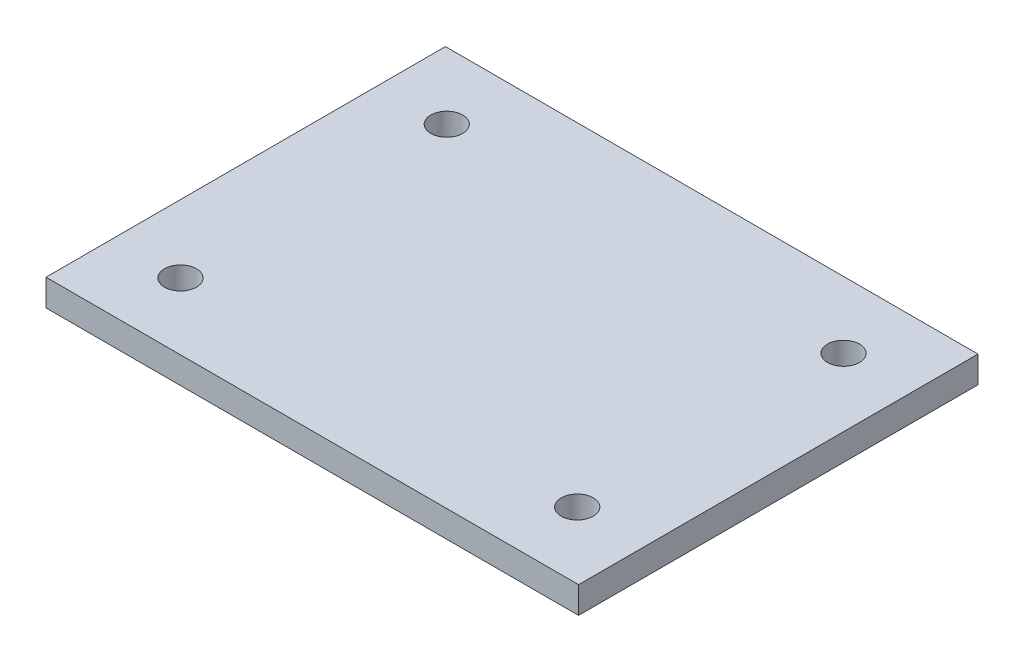
ISO-10303-21;
HEADER;
FILE_DESCRIPTION(('STEP AP214'),'2;1');
FILE_NAME('part.step','',(''),(''),'','','');
FILE_SCHEMA(('AUTOMOTIVE_DESIGN { 1 0 10303 214 1 1 1 1 }'));
ENDSEC;
DATA;
#1=APPLICATION_CONTEXT('core data for automotive mechanical design processes');
#2=APPLICATION_PROTOCOL_DEFINITION('international standard','automotive_design',2000,#1);
#3=PRODUCT_CONTEXT('',#1,'mechanical');
#4=PRODUCT('Part','Part','',(#3));
#5=PRODUCT_RELATED_PRODUCT_CATEGORY('part','',(#4));
#6=PRODUCT_DEFINITION_FORMATION('','',#4);
#7=PRODUCT_DEFINITION_CONTEXT('part definition',#1,'design');
#8=PRODUCT_DEFINITION('design','',#6,#7);
#9=PRODUCT_DEFINITION_SHAPE('','',#8);
#10=(LENGTH_UNIT() NAMED_UNIT(*) SI_UNIT(.MILLI.,.METRE.));
#11=(NAMED_UNIT(*) PLANE_ANGLE_UNIT() SI_UNIT($,.RADIAN.));
#12=(NAMED_UNIT(*) SI_UNIT($,.STERADIAN.) SOLID_ANGLE_UNIT());
#13=UNCERTAINTY_MEASURE_WITH_UNIT(LENGTH_MEASURE(1.E-05),#10,'distance_accuracy_value','');
#14=(GEOMETRIC_REPRESENTATION_CONTEXT(3) GLOBAL_UNCERTAINTY_ASSIGNED_CONTEXT((#13)) GLOBAL_UNIT_ASSIGNED_CONTEXT((#10,
#11,#12)) REPRESENTATION_CONTEXT('',''));
#15=CARTESIAN_POINT('',(0.,0.,0.));
#16=DIRECTION('',(0.,0.,1.));
#17=DIRECTION('',(1.,0.,0.));
#18=AXIS2_PLACEMENT_3D('',#15,#16,#17);
#19=CARTESIAN_POINT('',(100.,10.,75.));
#20=DIRECTION('',(-1.,0.,0.));
#21=DIRECTION('',(0.,0.,1.));
#22=AXIS2_PLACEMENT_3D('',#19,#20,#21);
#23=PLANE('',#22);
#24=DIRECTION('',(0.,0.,-1.));
#25=VECTOR('',#24,1.);
#26=CARTESIAN_POINT('',(100.,0.,75.));
#27=LINE('',#26,#25);
#28=CARTESIAN_POINT('',(100.,0.,75.));
#29=VERTEX_POINT('',#28);
#30=CARTESIAN_POINT('',(100.,0.,-75.));
#31=VERTEX_POINT('',#30);
#32=EDGE_CURVE('E98',#29,#31,#27,.T.);
#33=ORIENTED_EDGE('',*,*,#32,.T.);
#34=DIRECTION('',(0.,-1.,0.));
#35=VECTOR('',#34,1.);
#36=CARTESIAN_POINT('',(100.,10.,-75.));
#37=LINE('',#36,#35);
#38=CARTESIAN_POINT('',(100.,10.,-75.));
#39=VERTEX_POINT('',#38);
#40=EDGE_CURVE('E11',#39,#31,#37,.T.);
#41=ORIENTED_EDGE('',*,*,#40,.F.);
#42=DIRECTION('',(0.,0.,-1.));
#43=VECTOR('',#42,1.);
#44=CARTESIAN_POINT('',(100.,10.,75.));
#45=LINE('',#44,#43);
#46=CARTESIAN_POINT('',(100.,10.,75.));
#47=VERTEX_POINT('',#46);
#48=EDGE_CURVE('E86',#47,#39,#45,.T.);
#49=ORIENTED_EDGE('',*,*,#48,.F.);
#50=DIRECTION('',(0.,-1.,0.));
#51=VECTOR('',#50,1.);
#52=CARTESIAN_POINT('',(100.,10.,75.));
#53=LINE('',#52,#51);
#54=EDGE_CURVE('E94',#47,#29,#53,.T.);
#55=ORIENTED_EDGE('',*,*,#54,.T.);
#56=EDGE_LOOP('',(#33,#41,#49,#55));
#57=FACE_BOUND('',#56,.T.);
#58=ADVANCED_FACE('F35',(#57),#23,.F.);
#59=CARTESIAN_POINT('',(-100.,10.,-75.));
#60=DIRECTION('',(0.,0.,1.));
#61=DIRECTION('',(1.,0.,0.));
#62=AXIS2_PLACEMENT_3D('',#59,#60,#61);
#63=PLANE('',#62);
#64=DIRECTION('',(-1.,0.,0.));
#65=VECTOR('',#64,1.);
#66=CARTESIAN_POINT('',(-100.,0.,-75.));
#67=LINE('',#66,#65);
#68=CARTESIAN_POINT('',(-100.,0.,-75.));
#69=VERTEX_POINT('',#68);
#70=EDGE_CURVE('E90',#31,#69,#67,.T.);
#71=ORIENTED_EDGE('',*,*,#70,.T.);
#72=DIRECTION('',(0.,-1.,0.));
#73=VECTOR('',#72,1.);
#74=CARTESIAN_POINT('',(-100.,10.,-75.));
#75=LINE('',#74,#73);
#76=CARTESIAN_POINT('',(-100.,10.,-75.));
#77=VERTEX_POINT('',#76);
#78=EDGE_CURVE('E43',#77,#69,#75,.T.);
#79=ORIENTED_EDGE('',*,*,#78,.F.);
#80=DIRECTION('',(-1.,0.,0.));
#81=VECTOR('',#80,1.);
#82=CARTESIAN_POINT('',(-100.,10.,-75.));
#83=LINE('',#82,#81);
#84=EDGE_CURVE('E81',#39,#77,#83,.T.);
#85=ORIENTED_EDGE('',*,*,#84,.F.);
#86=ORIENTED_EDGE('',*,*,#40,.T.);
#87=EDGE_LOOP('',(#71,#79,#85,#86));
#88=FACE_BOUND('',#87,.T.);
#89=ADVANCED_FACE('F89',(#88),#63,.F.);
#90=CARTESIAN_POINT('',(-100.,10.,75.));
#91=DIRECTION('',(1.,0.,0.));
#92=DIRECTION('',(0.,0.,-1.));
#93=AXIS2_PLACEMENT_3D('',#90,#91,#92);
#94=PLANE('',#93);
#95=DIRECTION('',(0.,0.,1.));
#96=VECTOR('',#95,1.);
#97=CARTESIAN_POINT('',(-100.,0.,75.));
#98=LINE('',#97,#96);
#99=CARTESIAN_POINT('',(-100.,0.,75.));
#100=VERTEX_POINT('',#99);
#101=EDGE_CURVE('E68',#69,#100,#98,.T.);
#102=ORIENTED_EDGE('',*,*,#101,.T.);
#103=DIRECTION('',(0.,-1.,0.));
#104=VECTOR('',#103,1.);
#105=CARTESIAN_POINT('',(-100.,10.,75.));
#106=LINE('',#105,#104);
#107=CARTESIAN_POINT('',(-100.,10.,75.));
#108=VERTEX_POINT('',#107);
#109=EDGE_CURVE('E91',#108,#100,#106,.T.);
#110=ORIENTED_EDGE('',*,*,#109,.F.);
#111=DIRECTION('',(0.,0.,1.));
#112=VECTOR('',#111,1.);
#113=CARTESIAN_POINT('',(-100.,10.,75.));
#114=LINE('',#113,#112);
#115=EDGE_CURVE('E84',#77,#108,#114,.T.);
#116=ORIENTED_EDGE('',*,*,#115,.F.);
#117=ORIENTED_EDGE('',*,*,#78,.T.);
#118=EDGE_LOOP('',(#102,#110,#116,#117));
#119=FACE_BOUND('',#118,.T.);
#120=ADVANCED_FACE('F92',(#119),#94,.F.);
#121=CARTESIAN_POINT('',(-100.,10.,75.));
#122=DIRECTION('',(0.,0.,-1.));
#123=DIRECTION('',(-1.,0.,0.));
#124=AXIS2_PLACEMENT_3D('',#121,#122,#123);
#125=PLANE('',#124);
#126=DIRECTION('',(1.,0.,0.));
#127=VECTOR('',#126,1.);
#128=CARTESIAN_POINT('',(-100.,0.,75.));
#129=LINE('',#128,#127);
#130=EDGE_CURVE('E74',#100,#29,#129,.T.);
#131=ORIENTED_EDGE('',*,*,#130,.T.);
#132=ORIENTED_EDGE('',*,*,#54,.F.);
#133=DIRECTION('',(1.,0.,0.));
#134=VECTOR('',#133,1.);
#135=CARTESIAN_POINT('',(-100.,10.,75.));
#136=LINE('',#135,#134);
#137=EDGE_CURVE('E51',#108,#47,#136,.T.);
#138=ORIENTED_EDGE('',*,*,#137,.F.);
#139=ORIENTED_EDGE('',*,*,#109,.T.);
#140=EDGE_LOOP('',(#131,#132,#138,#139));
#141=FACE_BOUND('',#140,.T.);
#142=ADVANCED_FACE('F106',(#141),#125,.F.);
#143=CARTESIAN_POINT('',(0.,10.,0.));
#144=DIRECTION('',(0.,-1.,0.));
#145=DIRECTION('',(0.,0.,-1.));
#146=AXIS2_PLACEMENT_3D('',#143,#144,#145);
#147=PLANE('',#146);
#148=CARTESIAN_POINT('',(-74.5,10.,-50.));
#149=DIRECTION('',(0.,1.,0.));
#150=DIRECTION('',(0.,0.,1.));
#151=AXIS2_PLACEMENT_3D('',#148,#149,#150);
#152=CIRCLE('',#151,6.);
#153=CARTESIAN_POINT('',(-74.5,10.,-44.));
#154=VERTEX_POINT('',#153);
#155=EDGE_CURVE('E127',#154,#154,#152,.T.);
#156=ORIENTED_EDGE('',*,*,#155,.F.);
#157=EDGE_LOOP('',(#156));
#158=FACE_BOUND('',#157,.T.);
#159=CARTESIAN_POINT('',(-74.5,10.,50.));
#160=DIRECTION('',(0.,1.,0.));
#161=DIRECTION('',(0.,0.,1.));
#162=AXIS2_PLACEMENT_3D('',#159,#160,#161);
#163=CIRCLE('',#162,6.);
#164=CARTESIAN_POINT('',(-74.5,10.,56.));
#165=VERTEX_POINT('',#164);
#166=EDGE_CURVE('E121',#165,#165,#163,.T.);
#167=ORIENTED_EDGE('',*,*,#166,.F.);
#168=EDGE_LOOP('',(#167));
#169=FACE_BOUND('',#168,.T.);
#170=CARTESIAN_POINT('',(74.5,10.,50.));
#171=DIRECTION('',(0.,1.,0.));
#172=DIRECTION('',(0.,0.,1.));
#173=AXIS2_PLACEMENT_3D('',#170,#171,#172);
#174=CIRCLE('',#173,6.);
#175=CARTESIAN_POINT('',(74.5,10.,56.));
#176=VERTEX_POINT('',#175);
#177=EDGE_CURVE('E115',#176,#176,#174,.T.);
#178=ORIENTED_EDGE('',*,*,#177,.F.);
#179=EDGE_LOOP('',(#178));
#180=FACE_BOUND('',#179,.T.);
#181=CARTESIAN_POINT('',(74.5,10.,-50.));
#182=DIRECTION('',(0.,1.,0.));
#183=DIRECTION('',(0.,0.,1.));
#184=AXIS2_PLACEMENT_3D('',#181,#182,#183);
#185=CIRCLE('',#184,6.);
#186=CARTESIAN_POINT('',(74.5,10.,-44.));
#187=VERTEX_POINT('',#186);
#188=EDGE_CURVE('E101',#187,#187,#185,.T.);
#189=ORIENTED_EDGE('',*,*,#188,.F.);
#190=EDGE_LOOP('',(#189));
#191=FACE_BOUND('',#190,.T.);
#192=ORIENTED_EDGE('',*,*,#48,.T.);
#193=ORIENTED_EDGE('',*,*,#84,.T.);
#194=ORIENTED_EDGE('',*,*,#115,.T.);
#195=ORIENTED_EDGE('',*,*,#137,.T.);
#196=EDGE_LOOP('',(#192,#193,#194,#195));
#197=FACE_BOUND('',#196,.T.);
#198=ADVANCED_FACE('F82',(#158,#169,#180,#191,#197),#147,.F.);
#199=CARTESIAN_POINT('',(0.,0.,0.));
#200=DIRECTION('',(0.,-1.,0.));
#201=DIRECTION('',(0.,0.,-1.));
#202=AXIS2_PLACEMENT_3D('',#199,#200,#201);
#203=PLANE('',#202);
#204=CARTESIAN_POINT('',(-74.5,0.,-50.));
#205=DIRECTION('',(0.,-1.,0.));
#206=DIRECTION('',(0.,0.,-1.));
#207=AXIS2_PLACEMENT_3D('',#204,#205,#206);
#208=CIRCLE('',#207,6.);
#209=CARTESIAN_POINT('',(-74.5,0.,-56.));
#210=VERTEX_POINT('',#209);
#211=EDGE_CURVE('E130',#210,#210,#208,.F.);
#212=ORIENTED_EDGE('',*,*,#211,.T.);
#213=EDGE_LOOP('',(#212));
#214=FACE_BOUND('',#213,.T.);
#215=CARTESIAN_POINT('',(-74.5,0.,50.));
#216=DIRECTION('',(0.,-1.,0.));
#217=DIRECTION('',(0.,0.,-1.));
#218=AXIS2_PLACEMENT_3D('',#215,#216,#217);
#219=CIRCLE('',#218,6.);
#220=CARTESIAN_POINT('',(-74.5,0.,44.));
#221=VERTEX_POINT('',#220);
#222=EDGE_CURVE('E124',#221,#221,#219,.F.);
#223=ORIENTED_EDGE('',*,*,#222,.T.);
#224=EDGE_LOOP('',(#223));
#225=FACE_BOUND('',#224,.T.);
#226=CARTESIAN_POINT('',(74.5,0.,50.));
#227=DIRECTION('',(0.,-1.,0.));
#228=DIRECTION('',(0.,0.,-1.));
#229=AXIS2_PLACEMENT_3D('',#226,#227,#228);
#230=CIRCLE('',#229,6.);
#231=CARTESIAN_POINT('',(74.5,0.,44.));
#232=VERTEX_POINT('',#231);
#233=EDGE_CURVE('E118',#232,#232,#230,.F.);
#234=ORIENTED_EDGE('',*,*,#233,.T.);
#235=EDGE_LOOP('',(#234));
#236=FACE_BOUND('',#235,.T.);
#237=CARTESIAN_POINT('',(74.5,0.,-50.));
#238=DIRECTION('',(0.,-1.,0.));
#239=DIRECTION('',(0.,0.,-1.));
#240=AXIS2_PLACEMENT_3D('',#237,#238,#239);
#241=CIRCLE('',#240,6.);
#242=CARTESIAN_POINT('',(74.5,0.,-56.));
#243=VERTEX_POINT('',#242);
#244=EDGE_CURVE('E112',#243,#243,#241,.F.);
#245=ORIENTED_EDGE('',*,*,#244,.T.);
#246=EDGE_LOOP('',(#245));
#247=FACE_BOUND('',#246,.T.);
#248=ORIENTED_EDGE('',*,*,#32,.F.);
#249=ORIENTED_EDGE('',*,*,#130,.F.);
#250=ORIENTED_EDGE('',*,*,#101,.F.);
#251=ORIENTED_EDGE('',*,*,#70,.F.);
#252=EDGE_LOOP('',(#248,#249,#250,#251));
#253=FACE_BOUND('',#252,.T.);
#254=ADVANCED_FACE('F109',(#214,#225,#236,#247,#253),#203,.T.);
#255=CARTESIAN_POINT('',(74.5,-0.000999999999999265,-50.));
#256=DIRECTION('',(0.,1.,0.));
#257=DIRECTION('',(0.,0.,1.));
#258=AXIS2_PLACEMENT_3D('',#255,#256,#257);
#259=CYLINDRICAL_SURFACE('',#258,6.);
#260=ORIENTED_EDGE('',*,*,#244,.F.);
#261=EDGE_LOOP('',(#260));
#262=FACE_BOUND('',#261,.T.);
#263=ORIENTED_EDGE('',*,*,#188,.T.);
#264=EDGE_LOOP('',(#263));
#265=FACE_BOUND('',#264,.T.);
#266=ADVANCED_FACE('F147',(#262,#265),#259,.F.);
#267=CARTESIAN_POINT('',(74.5,-0.000999999999999265,50.));
#268=DIRECTION('',(0.,1.,0.));
#269=DIRECTION('',(0.,0.,1.));
#270=AXIS2_PLACEMENT_3D('',#267,#268,#269);
#271=CYLINDRICAL_SURFACE('',#270,6.);
#272=ORIENTED_EDGE('',*,*,#233,.F.);
#273=EDGE_LOOP('',(#272));
#274=FACE_BOUND('',#273,.T.);
#275=ORIENTED_EDGE('',*,*,#177,.T.);
#276=EDGE_LOOP('',(#275));
#277=FACE_BOUND('',#276,.T.);
#278=ADVANCED_FACE('F149',(#274,#277),#271,.F.);
#279=CARTESIAN_POINT('',(-74.5,-0.000999999999999265,50.));
#280=DIRECTION('',(0.,1.,0.));
#281=DIRECTION('',(0.,0.,1.));
#282=AXIS2_PLACEMENT_3D('',#279,#280,#281);
#283=CYLINDRICAL_SURFACE('',#282,6.);
#284=ORIENTED_EDGE('',*,*,#222,.F.);
#285=EDGE_LOOP('',(#284));
#286=FACE_BOUND('',#285,.T.);
#287=ORIENTED_EDGE('',*,*,#166,.T.);
#288=EDGE_LOOP('',(#287));
#289=FACE_BOUND('',#288,.T.);
#290=ADVANCED_FACE('F156',(#286,#289),#283,.F.);
#291=CARTESIAN_POINT('',(-74.5,-0.000999999999999265,-50.));
#292=DIRECTION('',(0.,1.,0.));
#293=DIRECTION('',(0.,0.,1.));
#294=AXIS2_PLACEMENT_3D('',#291,#292,#293);
#295=CYLINDRICAL_SURFACE('',#294,6.);
#296=ORIENTED_EDGE('',*,*,#211,.F.);
#297=EDGE_LOOP('',(#296));
#298=FACE_BOUND('',#297,.T.);
#299=ORIENTED_EDGE('',*,*,#155,.T.);
#300=EDGE_LOOP('',(#299));
#301=FACE_BOUND('',#300,.T.);
#302=ADVANCED_FACE('F136',(#298,#301),#295,.F.);
#303=CLOSED_SHELL('',(#58,#89,#120,#142,#198,#254,#266,#278,#290,#302));
#304=MANIFOLD_SOLID_BREP('B2',#303);
#305=ADVANCED_BREP_SHAPE_REPRESENTATION('',(#18,#304),#14);
#306=SHAPE_DEFINITION_REPRESENTATION(#9,#305);
ENDSEC;
END-ISO-10303-21;
